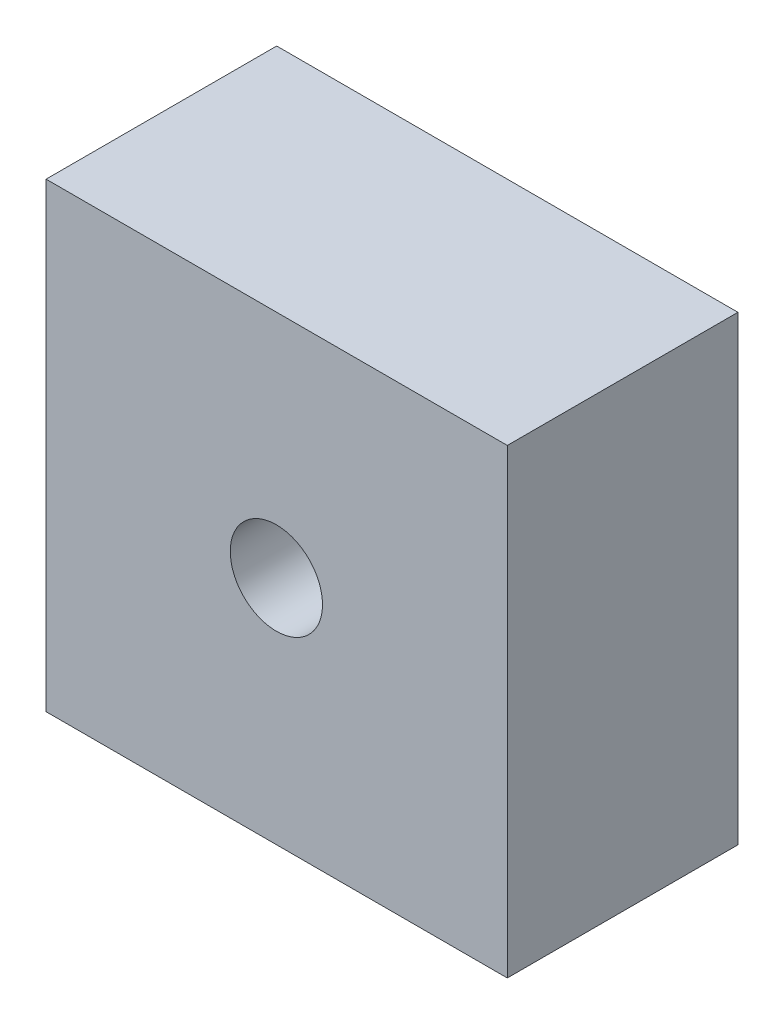
ISO-10303-21;
HEADER;
FILE_DESCRIPTION(('STEP AP214'),'2;1');
FILE_NAME('part.step','',(''),(''),'','','');
FILE_SCHEMA(('AUTOMOTIVE_DESIGN { 1 0 10303 214 1 1 1 1 }'));
ENDSEC;
DATA;
#1=APPLICATION_CONTEXT('core data for automotive mechanical design processes');
#2=APPLICATION_PROTOCOL_DEFINITION('international standard','automotive_design',2000,#1);
#3=PRODUCT_CONTEXT('',#1,'mechanical');
#4=PRODUCT('Part','Part','',(#3));
#5=PRODUCT_RELATED_PRODUCT_CATEGORY('part','',(#4));
#6=PRODUCT_DEFINITION_FORMATION('','',#4);
#7=PRODUCT_DEFINITION_CONTEXT('part definition',#1,'design');
#8=PRODUCT_DEFINITION('design','',#6,#7);
#9=PRODUCT_DEFINITION_SHAPE('','',#8);
#10=(LENGTH_UNIT() NAMED_UNIT(*) SI_UNIT(.MILLI.,.METRE.));
#11=(NAMED_UNIT(*) PLANE_ANGLE_UNIT() SI_UNIT($,.RADIAN.));
#12=(NAMED_UNIT(*) SI_UNIT($,.STERADIAN.) SOLID_ANGLE_UNIT());
#13=UNCERTAINTY_MEASURE_WITH_UNIT(LENGTH_MEASURE(1.E-05),#10,'distance_accuracy_value','');
#14=(GEOMETRIC_REPRESENTATION_CONTEXT(3) GLOBAL_UNCERTAINTY_ASSIGNED_CONTEXT((#13)) GLOBAL_UNIT_ASSIGNED_CONTEXT((#10,
#11,#12)) REPRESENTATION_CONTEXT('',''));
#15=CARTESIAN_POINT('',(0.,0.,0.));
#16=DIRECTION('',(0.,0.,1.));
#17=DIRECTION('',(1.,0.,0.));
#18=AXIS2_PLACEMENT_3D('',#15,#16,#17);
#19=CARTESIAN_POINT('',(0.,0.,10.));
#20=DIRECTION('',(1.,0.,0.));
#21=DIRECTION('',(0.,0.,-1.));
#22=AXIS2_PLACEMENT_3D('',#19,#20,#21);
#23=PLANE('',#22);
#24=DIRECTION('',(0.,-1.,0.));
#25=VECTOR('',#24,1.);
#26=CARTESIAN_POINT('',(0.,0.,0.));
#27=LINE('',#26,#25);
#28=CARTESIAN_POINT('',(0.,20.,0.));
#29=VERTEX_POINT('',#28);
#30=CARTESIAN_POINT('',(0.,0.,0.));
#31=VERTEX_POINT('',#30);
#32=EDGE_CURVE('E104',#29,#31,#27,.T.);
#33=ORIENTED_EDGE('',*,*,#32,.T.);
#34=DIRECTION('',(0.,0.,-1.));
#35=VECTOR('',#34,1.);
#36=CARTESIAN_POINT('',(0.,0.,10.));
#37=LINE('',#36,#35);
#38=CARTESIAN_POINT('',(0.,0.,10.));
#39=VERTEX_POINT('',#38);
#40=EDGE_CURVE('E11',#39,#31,#37,.T.);
#41=ORIENTED_EDGE('',*,*,#40,.F.);
#42=DIRECTION('',(0.,-1.,0.));
#43=VECTOR('',#42,1.);
#44=CARTESIAN_POINT('',(0.,0.,10.));
#45=LINE('',#44,#43);
#46=CARTESIAN_POINT('',(0.,20.,10.));
#47=VERTEX_POINT('',#46);
#48=EDGE_CURVE('E91',#47,#39,#45,.T.);
#49=ORIENTED_EDGE('',*,*,#48,.F.);
#50=DIRECTION('',(0.,0.,-1.));
#51=VECTOR('',#50,1.);
#52=CARTESIAN_POINT('',(0.,20.,10.));
#53=LINE('',#52,#51);
#54=EDGE_CURVE('E101',#47,#29,#53,.T.);
#55=ORIENTED_EDGE('',*,*,#54,.T.);
#56=EDGE_LOOP('',(#33,#41,#49,#55));
#57=FACE_BOUND('',#56,.T.);
#58=ADVANCED_FACE('F45',(#57),#23,.F.);
#59=CARTESIAN_POINT('',(0.,0.,10.));
#60=DIRECTION('',(0.,1.,0.));
#61=DIRECTION('',(0.,0.,1.));
#62=AXIS2_PLACEMENT_3D('',#59,#60,#61);
#63=PLANE('',#62);
#64=DIRECTION('',(1.,0.,0.));
#65=VECTOR('',#64,1.);
#66=CARTESIAN_POINT('',(0.,0.,0.));
#67=LINE('',#66,#65);
#68=CARTESIAN_POINT('',(20.,0.,0.));
#69=VERTEX_POINT('',#68);
#70=EDGE_CURVE('E100',#31,#69,#67,.T.);
#71=ORIENTED_EDGE('',*,*,#70,.T.);
#72=DIRECTION('',(0.,0.,-1.));
#73=VECTOR('',#72,1.);
#74=CARTESIAN_POINT('',(20.,0.,10.));
#75=LINE('',#74,#73);
#76=CARTESIAN_POINT('',(20.,0.,10.));
#77=VERTEX_POINT('',#76);
#78=EDGE_CURVE('E49',#77,#69,#75,.T.);
#79=ORIENTED_EDGE('',*,*,#78,.F.);
#80=DIRECTION('',(1.,0.,0.));
#81=VECTOR('',#80,1.);
#82=CARTESIAN_POINT('',(0.,0.,10.));
#83=LINE('',#82,#81);
#84=EDGE_CURVE('E86',#39,#77,#83,.T.);
#85=ORIENTED_EDGE('',*,*,#84,.F.);
#86=ORIENTED_EDGE('',*,*,#40,.T.);
#87=EDGE_LOOP('',(#71,#79,#85,#86));
#88=FACE_BOUND('',#87,.T.);
#89=ADVANCED_FACE('F96',(#88),#63,.F.);
#90=CARTESIAN_POINT('',(20.,0.,10.));
#91=DIRECTION('',(-1.,0.,0.));
#92=DIRECTION('',(0.,0.,1.));
#93=AXIS2_PLACEMENT_3D('',#90,#91,#92);
#94=PLANE('',#93);
#95=DIRECTION('',(0.,1.,0.));
#96=VECTOR('',#95,1.);
#97=CARTESIAN_POINT('',(20.,0.,0.));
#98=LINE('',#97,#96);
#99=CARTESIAN_POINT('',(20.,20.,0.));
#100=VERTEX_POINT('',#99);
#101=EDGE_CURVE('E73',#69,#100,#98,.T.);
#102=ORIENTED_EDGE('',*,*,#101,.T.);
#103=DIRECTION('',(0.,0.,-1.));
#104=VECTOR('',#103,1.);
#105=CARTESIAN_POINT('',(20.,20.,10.));
#106=LINE('',#105,#104);
#107=CARTESIAN_POINT('',(20.,20.,10.));
#108=VERTEX_POINT('',#107);
#109=EDGE_CURVE('E98',#108,#100,#106,.T.);
#110=ORIENTED_EDGE('',*,*,#109,.F.);
#111=DIRECTION('',(0.,1.,0.));
#112=VECTOR('',#111,1.);
#113=CARTESIAN_POINT('',(20.,0.,10.));
#114=LINE('',#113,#112);
#115=EDGE_CURVE('E93',#77,#108,#114,.T.);
#116=ORIENTED_EDGE('',*,*,#115,.F.);
#117=ORIENTED_EDGE('',*,*,#78,.T.);
#118=EDGE_LOOP('',(#102,#110,#116,#117));
#119=FACE_BOUND('',#118,.T.);
#120=ADVANCED_FACE('F97',(#119),#94,.F.);
#121=CARTESIAN_POINT('',(0.,20.,10.));
#122=DIRECTION('',(0.,-1.,0.));
#123=DIRECTION('',(0.,0.,-1.));
#124=AXIS2_PLACEMENT_3D('',#121,#122,#123);
#125=PLANE('',#124);
#126=DIRECTION('',(-1.,0.,0.));
#127=VECTOR('',#126,1.);
#128=CARTESIAN_POINT('',(0.,20.,0.));
#129=LINE('',#128,#127);
#130=EDGE_CURVE('E81',#100,#29,#129,.T.);
#131=ORIENTED_EDGE('',*,*,#130,.T.);
#132=ORIENTED_EDGE('',*,*,#54,.F.);
#133=DIRECTION('',(-1.,0.,0.));
#134=VECTOR('',#133,1.);
#135=CARTESIAN_POINT('',(0.,20.,10.));
#136=LINE('',#135,#134);
#137=EDGE_CURVE('E59',#108,#47,#136,.T.);
#138=ORIENTED_EDGE('',*,*,#137,.F.);
#139=ORIENTED_EDGE('',*,*,#109,.T.);
#140=EDGE_LOOP('',(#131,#132,#138,#139));
#141=FACE_BOUND('',#140,.T.);
#142=ADVANCED_FACE('F114',(#141),#125,.F.);
#143=CARTESIAN_POINT('',(0.,0.,10.));
#144=DIRECTION('',(0.,0.,-1.));
#145=DIRECTION('',(-1.,0.,0.));
#146=AXIS2_PLACEMENT_3D('',#143,#144,#145);
#147=PLANE('',#146);
#148=CARTESIAN_POINT('',(9.98648737498797,10.0143055988724,10.));
#149=DIRECTION('',(0.,0.,1.));
#150=DIRECTION('',(1.,0.,0.));
#151=AXIS2_PLACEMENT_3D('',#148,#149,#150);
#152=CIRCLE('',#151,2.00000000000001);
#153=CARTESIAN_POINT('',(11.986487374988,10.0143055988724,10.));
#154=VERTEX_POINT('',#153);
#155=EDGE_CURVE('E123',#154,#154,#152,.T.);
#156=ORIENTED_EDGE('',*,*,#155,.F.);
#157=EDGE_LOOP('',(#156));
#158=FACE_BOUND('',#157,.T.);
#159=ORIENTED_EDGE('',*,*,#48,.T.);
#160=ORIENTED_EDGE('',*,*,#84,.T.);
#161=ORIENTED_EDGE('',*,*,#115,.T.);
#162=ORIENTED_EDGE('',*,*,#137,.T.);
#163=EDGE_LOOP('',(#159,#160,#161,#162));
#164=FACE_BOUND('',#163,.T.);
#165=ADVANCED_FACE('F90',(#158,#164),#147,.F.);
#166=CARTESIAN_POINT('',(0.,0.,0.));
#167=DIRECTION('',(0.,0.,-1.));
#168=DIRECTION('',(-1.,0.,0.));
#169=AXIS2_PLACEMENT_3D('',#166,#167,#168);
#170=PLANE('',#169);
#171=CARTESIAN_POINT('',(9.98648737498797,10.0143055988724,0.));
#172=DIRECTION('',(0.,0.,1.));
#173=DIRECTION('',(1.,0.,0.));
#174=AXIS2_PLACEMENT_3D('',#171,#172,#173);
#175=CIRCLE('',#174,2.00000000000001);
#176=CARTESIAN_POINT('',(11.986487374988,10.0143055988724,0.));
#177=VERTEX_POINT('',#176);
#178=EDGE_CURVE('E107',#177,#177,#175,.T.);
#179=ORIENTED_EDGE('',*,*,#178,.T.);
#180=EDGE_LOOP('',(#179));
#181=FACE_BOUND('',#180,.T.);
#182=ORIENTED_EDGE('',*,*,#32,.F.);
#183=ORIENTED_EDGE('',*,*,#130,.F.);
#184=ORIENTED_EDGE('',*,*,#101,.F.);
#185=ORIENTED_EDGE('',*,*,#70,.F.);
#186=EDGE_LOOP('',(#182,#183,#184,#185));
#187=FACE_BOUND('',#186,.T.);
#188=ADVANCED_FACE('F118',(#181,#187),#170,.T.);
#189=CARTESIAN_POINT('',(9.98648737498797,10.0143055988724,10.));
#190=DIRECTION('',(0.,0.,1.));
#191=DIRECTION('',(1.,0.,0.));
#192=AXIS2_PLACEMENT_3D('',#189,#190,#191);
#193=CYLINDRICAL_SURFACE('',#192,2.00000000000001);
#194=ORIENTED_EDGE('',*,*,#178,.F.);
#195=EDGE_LOOP('',(#194));
#196=FACE_BOUND('',#195,.T.);
#197=ORIENTED_EDGE('',*,*,#155,.T.);
#198=EDGE_LOOP('',(#197));
#199=FACE_BOUND('',#198,.T.);
#200=ADVANCED_FACE('F122',(#196,#199),#193,.F.);
#201=CLOSED_SHELL('',(#58,#89,#120,#142,#165,#188,#200));
#202=MANIFOLD_SOLID_BREP('B2',#201);
#203=ADVANCED_BREP_SHAPE_REPRESENTATION('',(#18,#202),#14);
#204=SHAPE_DEFINITION_REPRESENTATION(#9,#203);
ENDSEC;
END-ISO-10303-21;
